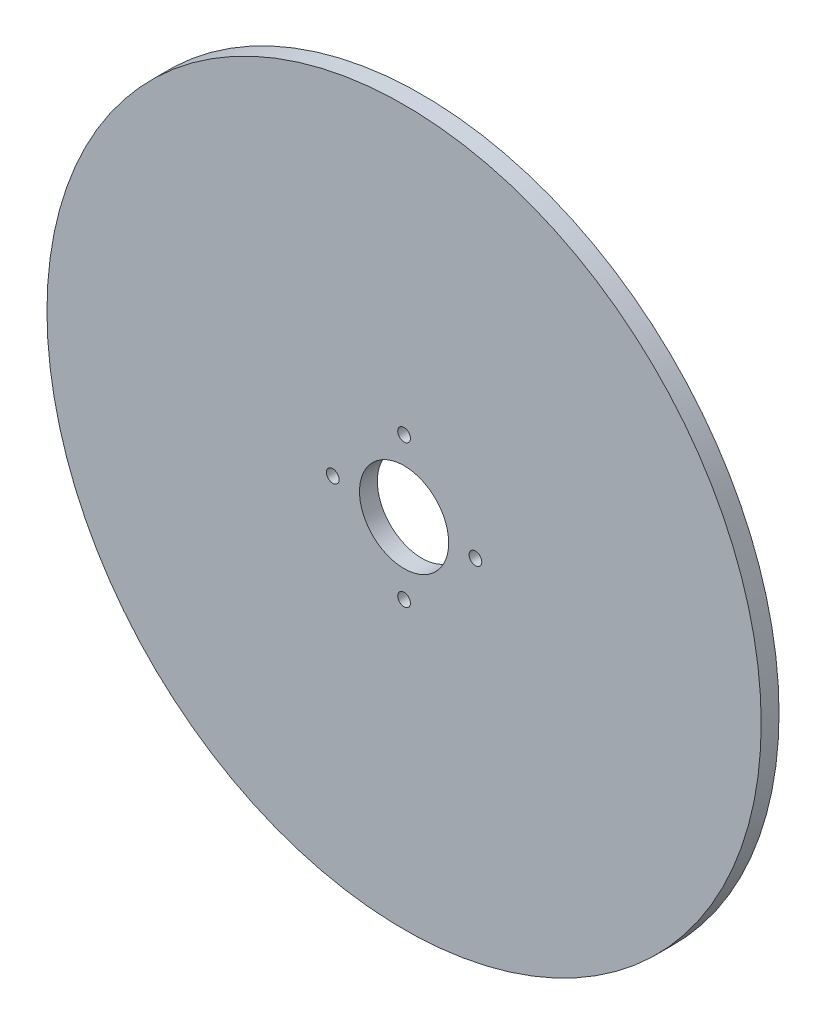
ISO-10303-21;
HEADER;
FILE_DESCRIPTION(('STEP AP214'),'2;1');
FILE_NAME('part.step','',(''),(''),'','','');
FILE_SCHEMA(('AUTOMOTIVE_DESIGN { 1 0 10303 214 1 1 1 1 }'));
ENDSEC;
DATA;
#1=APPLICATION_CONTEXT('core data for automotive mechanical design processes');
#2=APPLICATION_PROTOCOL_DEFINITION('international standard','automotive_design',2000,#1);
#3=PRODUCT_CONTEXT('',#1,'mechanical');
#4=PRODUCT('Part','Part','',(#3));
#5=PRODUCT_RELATED_PRODUCT_CATEGORY('part','',(#4));
#6=PRODUCT_DEFINITION_FORMATION('','',#4);
#7=PRODUCT_DEFINITION_CONTEXT('part definition',#1,'design');
#8=PRODUCT_DEFINITION('design','',#6,#7);
#9=PRODUCT_DEFINITION_SHAPE('','',#8);
#10=(LENGTH_UNIT() NAMED_UNIT(*) SI_UNIT(.MILLI.,.METRE.));
#11=(NAMED_UNIT(*) PLANE_ANGLE_UNIT() SI_UNIT($,.RADIAN.));
#12=(NAMED_UNIT(*) SI_UNIT($,.STERADIAN.) SOLID_ANGLE_UNIT());
#13=UNCERTAINTY_MEASURE_WITH_UNIT(LENGTH_MEASURE(1.E-05),#10,'distance_accuracy_value','');
#14=(GEOMETRIC_REPRESENTATION_CONTEXT(3) GLOBAL_UNCERTAINTY_ASSIGNED_CONTEXT((#13)) GLOBAL_UNIT_ASSIGNED_CONTEXT((#10,
#11,#12)) REPRESENTATION_CONTEXT('',''));
#15=CARTESIAN_POINT('',(0.,0.,0.));
#16=DIRECTION('',(0.,0.,1.));
#17=DIRECTION('',(1.,0.,0.));
#18=AXIS2_PLACEMENT_3D('',#15,#16,#17);
#19=CARTESIAN_POINT('',(0.,0.,3.175));
#20=DIRECTION('',(0.,0.,1.));
#21=DIRECTION('',(1.,0.,0.));
#22=AXIS2_PLACEMENT_3D('',#19,#20,#21);
#23=PLANE('',#22);
#24=CARTESIAN_POINT('',(0.,12.7,3.175));
#25=DIRECTION('',(0.,0.,1.));
#26=DIRECTION('',(1.,0.,0.));
#27=AXIS2_PLACEMENT_3D('',#24,#25,#26);
#28=CIRCLE('',#27,1.1303);
#29=CARTESIAN_POINT('',(1.1303,12.7,3.175));
#30=VERTEX_POINT('',#29);
#31=EDGE_CURVE('E69',#30,#30,#28,.T.);
#32=ORIENTED_EDGE('',*,*,#31,.F.);
#33=EDGE_LOOP('',(#32));
#34=FACE_BOUND('',#33,.T.);
#35=CARTESIAN_POINT('',(0.,-12.7,3.175));
#36=DIRECTION('',(0.,0.,1.));
#37=DIRECTION('',(1.,0.,0.));
#38=AXIS2_PLACEMENT_3D('',#35,#36,#37);
#39=CIRCLE('',#38,1.1303);
#40=CARTESIAN_POINT('',(1.1303,-12.7,3.175));
#41=VERTEX_POINT('',#40);
#42=EDGE_CURVE('E63',#41,#41,#39,.T.);
#43=ORIENTED_EDGE('',*,*,#42,.F.);
#44=EDGE_LOOP('',(#43));
#45=FACE_BOUND('',#44,.T.);
#46=CARTESIAN_POINT('',(12.7,0.,3.175));
#47=DIRECTION('',(0.,0.,1.));
#48=DIRECTION('',(1.,0.,0.));
#49=AXIS2_PLACEMENT_3D('',#46,#47,#48);
#50=CIRCLE('',#49,1.1303);
#51=CARTESIAN_POINT('',(13.8303,0.,3.175));
#52=VERTEX_POINT('',#51);
#53=EDGE_CURVE('E57',#52,#52,#50,.T.);
#54=ORIENTED_EDGE('',*,*,#53,.F.);
#55=EDGE_LOOP('',(#54));
#56=FACE_BOUND('',#55,.T.);
#57=CARTESIAN_POINT('',(-12.7,0.,3.175));
#58=DIRECTION('',(0.,0.,1.));
#59=DIRECTION('',(1.,0.,0.));
#60=AXIS2_PLACEMENT_3D('',#57,#58,#59);
#61=CIRCLE('',#60,1.1303);
#62=CARTESIAN_POINT('',(-11.5697,0.,3.175));
#63=VERTEX_POINT('',#62);
#64=EDGE_CURVE('E54',#63,#63,#61,.T.);
#65=ORIENTED_EDGE('',*,*,#64,.F.);
#66=EDGE_LOOP('',(#65));
#67=FACE_BOUND('',#66,.T.);
#68=CARTESIAN_POINT('',(0.,0.,3.175));
#69=DIRECTION('',(0.,0.,1.));
#70=DIRECTION('',(1.,0.,0.));
#71=AXIS2_PLACEMENT_3D('',#68,#69,#70);
#72=CIRCLE('',#71,63.5762);
#73=CARTESIAN_POINT('',(63.5762,0.,3.175));
#74=VERTEX_POINT('',#73);
#75=EDGE_CURVE('E10',#74,#74,#72,.T.);
#76=ORIENTED_EDGE('',*,*,#75,.T.);
#77=EDGE_LOOP('',(#76));
#78=FACE_BOUND('',#77,.T.);
#79=CARTESIAN_POINT('',(0.,0.,3.175));
#80=DIRECTION('',(0.,0.,1.));
#81=DIRECTION('',(1.,0.,0.));
#82=AXIS2_PLACEMENT_3D('',#79,#80,#81);
#83=CIRCLE('',#82,7.9375);
#84=CARTESIAN_POINT('',(7.9375,0.,3.175));
#85=VERTEX_POINT('',#84);
#86=EDGE_CURVE('E44',#85,#85,#83,.T.);
#87=ORIENTED_EDGE('',*,*,#86,.F.);
#88=EDGE_LOOP('',(#87));
#89=FACE_BOUND('',#88,.T.);
#90=ADVANCED_FACE('F31',(#34,#45,#56,#67,#78,#89),#23,.T.);
#91=CARTESIAN_POINT('',(0.,0.,0.));
#92=DIRECTION('',(0.,0.,1.));
#93=DIRECTION('',(1.,0.,0.));
#94=AXIS2_PLACEMENT_3D('',#91,#92,#93);
#95=PLANE('',#94);
#96=CARTESIAN_POINT('',(0.,12.7,0.));
#97=DIRECTION('',(0.,0.,1.));
#98=DIRECTION('',(1.,0.,0.));
#99=AXIS2_PLACEMENT_3D('',#96,#97,#98);
#100=CIRCLE('',#99,1.1303);
#101=CARTESIAN_POINT('',(1.1303,12.7,0.));
#102=VERTEX_POINT('',#101);
#103=EDGE_CURVE('E66',#102,#102,#100,.T.);
#104=ORIENTED_EDGE('',*,*,#103,.T.);
#105=EDGE_LOOP('',(#104));
#106=FACE_BOUND('',#105,.T.);
#107=CARTESIAN_POINT('',(0.,-12.7,0.));
#108=DIRECTION('',(0.,0.,1.));
#109=DIRECTION('',(1.,0.,0.));
#110=AXIS2_PLACEMENT_3D('',#107,#108,#109);
#111=CIRCLE('',#110,1.1303);
#112=CARTESIAN_POINT('',(1.1303,-12.7,0.));
#113=VERTEX_POINT('',#112);
#114=EDGE_CURVE('E60',#113,#113,#111,.T.);
#115=ORIENTED_EDGE('',*,*,#114,.T.);
#116=EDGE_LOOP('',(#115));
#117=FACE_BOUND('',#116,.T.);
#118=CARTESIAN_POINT('',(12.7,0.,0.));
#119=DIRECTION('',(0.,0.,1.));
#120=DIRECTION('',(1.,0.,0.));
#121=AXIS2_PLACEMENT_3D('',#118,#119,#120);
#122=CIRCLE('',#121,1.1303);
#123=CARTESIAN_POINT('',(13.8303,0.,0.));
#124=VERTEX_POINT('',#123);
#125=EDGE_CURVE('E35',#124,#124,#122,.T.);
#126=ORIENTED_EDGE('',*,*,#125,.T.);
#127=EDGE_LOOP('',(#126));
#128=FACE_BOUND('',#127,.T.);
#129=CARTESIAN_POINT('',(-12.7,0.,0.));
#130=DIRECTION('',(0.,0.,1.));
#131=DIRECTION('',(1.,0.,0.));
#132=AXIS2_PLACEMENT_3D('',#129,#130,#131);
#133=CIRCLE('',#132,1.1303);
#134=CARTESIAN_POINT('',(-11.5697,0.,0.));
#135=VERTEX_POINT('',#134);
#136=EDGE_CURVE('E49',#135,#135,#133,.T.);
#137=ORIENTED_EDGE('',*,*,#136,.T.);
#138=EDGE_LOOP('',(#137));
#139=FACE_BOUND('',#138,.T.);
#140=CARTESIAN_POINT('',(0.,0.,0.));
#141=DIRECTION('',(0.,0.,1.));
#142=DIRECTION('',(1.,0.,0.));
#143=AXIS2_PLACEMENT_3D('',#140,#141,#142);
#144=CIRCLE('',#143,63.5762);
#145=CARTESIAN_POINT('',(63.5762,0.,0.));
#146=VERTEX_POINT('',#145);
#147=EDGE_CURVE('E39',#146,#146,#144,.T.);
#148=ORIENTED_EDGE('',*,*,#147,.F.);
#149=EDGE_LOOP('',(#148));
#150=FACE_BOUND('',#149,.T.);
#151=CARTESIAN_POINT('',(0.,0.,0.));
#152=DIRECTION('',(0.,0.,1.));
#153=DIRECTION('',(1.,0.,0.));
#154=AXIS2_PLACEMENT_3D('',#151,#152,#153);
#155=CIRCLE('',#154,7.9375);
#156=CARTESIAN_POINT('',(7.9375,0.,0.));
#157=VERTEX_POINT('',#156);
#158=EDGE_CURVE('E46',#157,#157,#155,.T.);
#159=ORIENTED_EDGE('',*,*,#158,.T.);
#160=EDGE_LOOP('',(#159));
#161=FACE_BOUND('',#160,.T.);
#162=ADVANCED_FACE('F78',(#106,#117,#128,#139,#150,#161),#95,.F.);
#163=CARTESIAN_POINT('',(0.,0.,3.175));
#164=DIRECTION('',(0.,0.,-1.));
#165=DIRECTION('',(-1.,0.,0.));
#166=AXIS2_PLACEMENT_3D('',#163,#164,#165);
#167=CYLINDRICAL_SURFACE('',#166,63.5762);
#168=ORIENTED_EDGE('',*,*,#75,.F.);
#169=EDGE_LOOP('',(#168));
#170=FACE_BOUND('',#169,.T.);
#171=ORIENTED_EDGE('',*,*,#147,.T.);
#172=EDGE_LOOP('',(#171));
#173=FACE_BOUND('',#172,.T.);
#174=ADVANCED_FACE('F33',(#170,#173),#167,.T.);
#175=CARTESIAN_POINT('',(0.,0.,3.175));
#176=DIRECTION('',(0.,0.,-1.));
#177=DIRECTION('',(-1.,0.,0.));
#178=AXIS2_PLACEMENT_3D('',#175,#176,#177);
#179=CYLINDRICAL_SURFACE('',#178,7.9375);
#180=ORIENTED_EDGE('',*,*,#86,.T.);
#181=EDGE_LOOP('',(#180));
#182=FACE_BOUND('',#181,.T.);
#183=ORIENTED_EDGE('',*,*,#158,.F.);
#184=EDGE_LOOP('',(#183));
#185=FACE_BOUND('',#184,.T.);
#186=ADVANCED_FACE('F88',(#182,#185),#179,.F.);
#187=CARTESIAN_POINT('',(-12.7,0.,3.175));
#188=DIRECTION('',(0.,0.,1.));
#189=DIRECTION('',(1.,0.,0.));
#190=AXIS2_PLACEMENT_3D('',#187,#188,#189);
#191=CYLINDRICAL_SURFACE('',#190,1.1303);
#192=ORIENTED_EDGE('',*,*,#64,.T.);
#193=EDGE_LOOP('',(#192));
#194=FACE_BOUND('',#193,.T.);
#195=ORIENTED_EDGE('',*,*,#136,.F.);
#196=EDGE_LOOP('',(#195));
#197=FACE_BOUND('',#196,.T.);
#198=ADVANCED_FACE('F91',(#194,#197),#191,.F.);
#199=CARTESIAN_POINT('',(12.7,0.,3.175));
#200=DIRECTION('',(0.,0.,1.));
#201=DIRECTION('',(1.,0.,0.));
#202=AXIS2_PLACEMENT_3D('',#199,#200,#201);
#203=CYLINDRICAL_SURFACE('',#202,1.1303);
#204=ORIENTED_EDGE('',*,*,#53,.T.);
#205=EDGE_LOOP('',(#204));
#206=FACE_BOUND('',#205,.T.);
#207=ORIENTED_EDGE('',*,*,#125,.F.);
#208=EDGE_LOOP('',(#207));
#209=FACE_BOUND('',#208,.T.);
#210=ADVANCED_FACE('F105',(#206,#209),#203,.F.);
#211=CARTESIAN_POINT('',(0.,-12.7,3.175));
#212=DIRECTION('',(0.,0.,1.));
#213=DIRECTION('',(1.,0.,0.));
#214=AXIS2_PLACEMENT_3D('',#211,#212,#213);
#215=CYLINDRICAL_SURFACE('',#214,1.1303);
#216=ORIENTED_EDGE('',*,*,#42,.T.);
#217=EDGE_LOOP('',(#216));
#218=FACE_BOUND('',#217,.T.);
#219=ORIENTED_EDGE('',*,*,#114,.F.);
#220=EDGE_LOOP('',(#219));
#221=FACE_BOUND('',#220,.T.);
#222=ADVANCED_FACE('F109',(#218,#221),#215,.F.);
#223=CARTESIAN_POINT('',(0.,12.7,3.175));
#224=DIRECTION('',(0.,0.,1.));
#225=DIRECTION('',(1.,0.,0.));
#226=AXIS2_PLACEMENT_3D('',#223,#224,#225);
#227=CYLINDRICAL_SURFACE('',#226,1.1303);
#228=ORIENTED_EDGE('',*,*,#31,.T.);
#229=EDGE_LOOP('',(#228));
#230=FACE_BOUND('',#229,.T.);
#231=ORIENTED_EDGE('',*,*,#103,.F.);
#232=EDGE_LOOP('',(#231));
#233=FACE_BOUND('',#232,.T.);
#234=ADVANCED_FACE('F73',(#230,#233),#227,.F.);
#235=CLOSED_SHELL('',(#90,#162,#174,#186,#198,#210,#222,#234));
#236=MANIFOLD_SOLID_BREP('B2',#235);
#237=ADVANCED_BREP_SHAPE_REPRESENTATION('',(#18,#236),#14);
#238=SHAPE_DEFINITION_REPRESENTATION(#9,#237);
ENDSEC;
END-ISO-10303-21;
